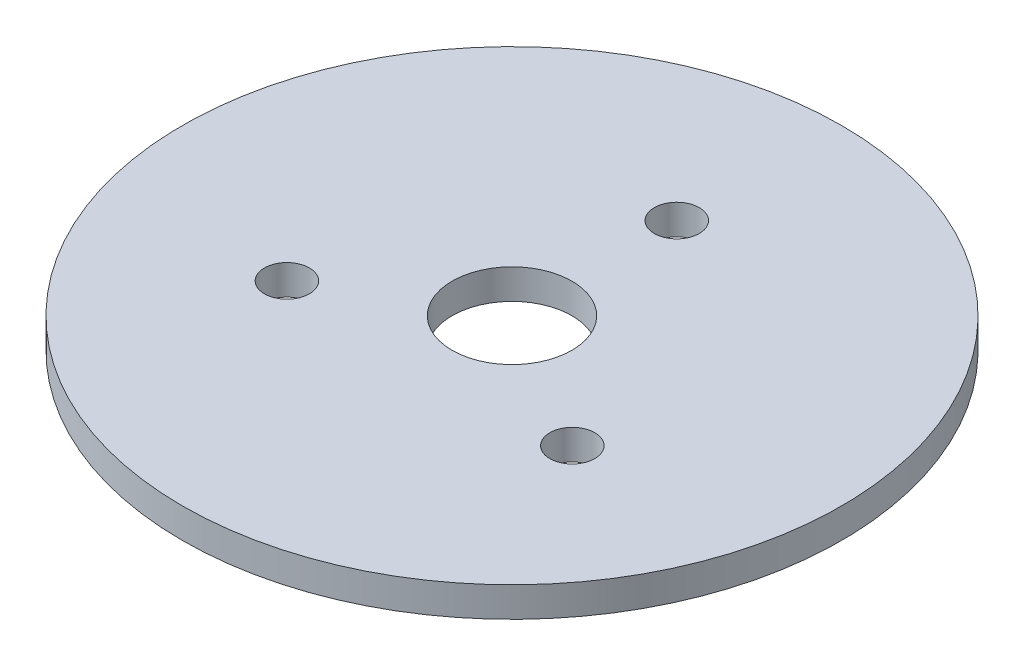
ISO-10303-21;
HEADER;
FILE_DESCRIPTION(('STEP AP214'),'2;1');
FILE_NAME('part.step','',(''),(''),'','','');
FILE_SCHEMA(('AUTOMOTIVE_DESIGN { 1 0 10303 214 1 1 1 1 }'));
ENDSEC;
DATA;
#1=APPLICATION_CONTEXT('core data for automotive mechanical design processes');
#2=APPLICATION_PROTOCOL_DEFINITION('international standard','automotive_design',2000,#1);
#3=PRODUCT_CONTEXT('',#1,'mechanical');
#4=PRODUCT('Part','Part','',(#3));
#5=PRODUCT_RELATED_PRODUCT_CATEGORY('part','',(#4));
#6=PRODUCT_DEFINITION_FORMATION('','',#4);
#7=PRODUCT_DEFINITION_CONTEXT('part definition',#1,'design');
#8=PRODUCT_DEFINITION('design','',#6,#7);
#9=PRODUCT_DEFINITION_SHAPE('','',#8);
#10=(LENGTH_UNIT() NAMED_UNIT(*) SI_UNIT(.MILLI.,.METRE.));
#11=(NAMED_UNIT(*) PLANE_ANGLE_UNIT() SI_UNIT($,.RADIAN.));
#12=(NAMED_UNIT(*) SI_UNIT($,.STERADIAN.) SOLID_ANGLE_UNIT());
#13=UNCERTAINTY_MEASURE_WITH_UNIT(LENGTH_MEASURE(1.E-05),#10,'distance_accuracy_value','');
#14=(GEOMETRIC_REPRESENTATION_CONTEXT(3) GLOBAL_UNCERTAINTY_ASSIGNED_CONTEXT((#13)) GLOBAL_UNIT_ASSIGNED_CONTEXT((#10,
#11,#12)) REPRESENTATION_CONTEXT('',''));
#15=CARTESIAN_POINT('',(0.,0.,0.));
#16=DIRECTION('',(0.,0.,1.));
#17=DIRECTION('',(1.,0.,0.));
#18=AXIS2_PLACEMENT_3D('',#15,#16,#17);
#19=CARTESIAN_POINT('',(0.,2.,0.));
#20=DIRECTION('',(0.,1.,0.));
#21=DIRECTION('',(0.,0.,1.));
#22=AXIS2_PLACEMENT_3D('',#19,#20,#21);
#23=PLANE('',#22);
#24=CARTESIAN_POINT('',(9.52627944162929,2.,5.49999999999973));
#25=DIRECTION('',(0.,1.,0.));
#26=DIRECTION('',(0.,0.,1.));
#27=AXIS2_PLACEMENT_3D('',#24,#25,#26);
#28=CIRCLE('',#27,1.50000000000042);
#29=CARTESIAN_POINT('',(9.52627944162929,2.,7.00000000000015));
#30=VERTEX_POINT('',#29);
#31=EDGE_CURVE('E56',#30,#30,#28,.T.);
#32=ORIENTED_EDGE('',*,*,#31,.F.);
#33=EDGE_LOOP('',(#32));
#34=FACE_BOUND('',#33,.T.);
#35=CARTESIAN_POINT('',(0.,2.,0.));
#36=DIRECTION('',(0.,1.,0.));
#37=DIRECTION('',(0.,0.,1.));
#38=AXIS2_PLACEMENT_3D('',#35,#36,#37);
#39=CIRCLE('',#38,4.);
#40=CARTESIAN_POINT('',(0.,2.,4.));
#41=VERTEX_POINT('',#40);
#42=EDGE_CURVE('E48',#41,#41,#39,.T.);
#43=ORIENTED_EDGE('',*,*,#42,.F.);
#44=EDGE_LOOP('',(#43));
#45=FACE_BOUND('',#44,.T.);
#46=CARTESIAN_POINT('',(0.,2.,0.));
#47=DIRECTION('',(0.,1.,0.));
#48=DIRECTION('',(0.,0.,1.));
#49=AXIS2_PLACEMENT_3D('',#46,#47,#48);
#50=CIRCLE('',#49,22.);
#51=CARTESIAN_POINT('',(0.,2.,22.));
#52=VERTEX_POINT('',#51);
#53=EDGE_CURVE('E10',#52,#52,#50,.T.);
#54=ORIENTED_EDGE('',*,*,#53,.T.);
#55=EDGE_LOOP('',(#54));
#56=FACE_BOUND('',#55,.T.);
#57=CARTESIAN_POINT('',(0.,2.,-11.));
#58=DIRECTION('',(0.,1.,0.));
#59=DIRECTION('',(0.,0.,1.));
#60=AXIS2_PLACEMENT_3D('',#57,#58,#59);
#61=CIRCLE('',#60,1.5);
#62=CARTESIAN_POINT('',(0.,2.,-9.5));
#63=VERTEX_POINT('',#62);
#64=EDGE_CURVE('E52',#63,#63,#61,.T.);
#65=ORIENTED_EDGE('',*,*,#64,.F.);
#66=EDGE_LOOP('',(#65));
#67=FACE_BOUND('',#66,.T.);
#68=CARTESIAN_POINT('',(-9.52627944162836,2.,5.50000000000027));
#69=DIRECTION('',(0.,1.,0.));
#70=DIRECTION('',(0.,0.,1.));
#71=AXIS2_PLACEMENT_3D('',#68,#69,#70);
#72=CIRCLE('',#71,1.50000000000062);
#73=CARTESIAN_POINT('',(-9.52627944162836,2.,7.00000000000088));
#74=VERTEX_POINT('',#73);
#75=EDGE_CURVE('E65',#74,#74,#72,.T.);
#76=ORIENTED_EDGE('',*,*,#75,.F.);
#77=EDGE_LOOP('',(#76));
#78=FACE_BOUND('',#77,.T.);
#79=ADVANCED_FACE('F40',(#34,#45,#56,#67,#78),#23,.T.);
#80=CARTESIAN_POINT('',(0.,0.,0.));
#81=DIRECTION('',(0.,1.,0.));
#82=DIRECTION('',(0.,0.,1.));
#83=AXIS2_PLACEMENT_3D('',#80,#81,#82);
#84=PLANE('',#83);
#85=CARTESIAN_POINT('',(0.,0.,0.));
#86=DIRECTION('',(0.,1.,0.));
#87=DIRECTION('',(0.,0.,1.));
#88=AXIS2_PLACEMENT_3D('',#85,#86,#87);
#89=CIRCLE('',#88,22.);
#90=CARTESIAN_POINT('',(0.,0.,22.));
#91=VERTEX_POINT('',#90);
#92=EDGE_CURVE('E41',#91,#91,#89,.T.);
#93=ORIENTED_EDGE('',*,*,#92,.F.);
#94=EDGE_LOOP('',(#93));
#95=FACE_BOUND('',#94,.T.);
#96=CARTESIAN_POINT('',(0.,0.,0.));
#97=DIRECTION('',(0.,1.,0.));
#98=DIRECTION('',(0.,0.,1.));
#99=AXIS2_PLACEMENT_3D('',#96,#97,#98);
#100=CIRCLE('',#99,4.);
#101=CARTESIAN_POINT('',(0.,0.,4.));
#102=VERTEX_POINT('',#101);
#103=EDGE_CURVE('E49',#102,#102,#100,.T.);
#104=ORIENTED_EDGE('',*,*,#103,.T.);
#105=EDGE_LOOP('',(#104));
#106=FACE_BOUND('',#105,.T.);
#107=CARTESIAN_POINT('',(0.,0.,-11.));
#108=DIRECTION('',(0.,1.,0.));
#109=DIRECTION('',(0.,0.,1.));
#110=AXIS2_PLACEMENT_3D('',#107,#108,#109);
#111=CIRCLE('',#110,1.5);
#112=CARTESIAN_POINT('',(0.,0.,-9.5));
#113=VERTEX_POINT('',#112);
#114=EDGE_CURVE('E57',#113,#113,#111,.T.);
#115=ORIENTED_EDGE('',*,*,#114,.T.);
#116=EDGE_LOOP('',(#115));
#117=FACE_BOUND('',#116,.T.);
#118=CARTESIAN_POINT('',(9.52627944162929,0.,5.49999999999973));
#119=DIRECTION('',(0.,1.,0.));
#120=DIRECTION('',(0.,0.,1.));
#121=AXIS2_PLACEMENT_3D('',#118,#119,#120);
#122=CIRCLE('',#121,1.50000000000042);
#123=CARTESIAN_POINT('',(9.52627944162929,0.,7.00000000000015));
#124=VERTEX_POINT('',#123);
#125=EDGE_CURVE('E62',#124,#124,#122,.T.);
#126=ORIENTED_EDGE('',*,*,#125,.T.);
#127=EDGE_LOOP('',(#126));
#128=FACE_BOUND('',#127,.T.);
#129=CARTESIAN_POINT('',(-9.52627944162836,0.,5.50000000000027));
#130=DIRECTION('',(0.,1.,0.));
#131=DIRECTION('',(0.,0.,1.));
#132=AXIS2_PLACEMENT_3D('',#129,#130,#131);
#133=CIRCLE('',#132,1.50000000000062);
#134=CARTESIAN_POINT('',(-9.52627944162836,0.,7.00000000000088));
#135=VERTEX_POINT('',#134);
#136=EDGE_CURVE('E66',#135,#135,#133,.T.);
#137=ORIENTED_EDGE('',*,*,#136,.T.);
#138=EDGE_LOOP('',(#137));
#139=FACE_BOUND('',#138,.T.);
#140=ADVANCED_FACE('F76',(#95,#106,#117,#128,#139),#84,.F.);
#141=CARTESIAN_POINT('',(0.,2.,0.));
#142=DIRECTION('',(0.,-1.,0.));
#143=DIRECTION('',(0.,0.,-1.));
#144=AXIS2_PLACEMENT_3D('',#141,#142,#143);
#145=CYLINDRICAL_SURFACE('',#144,22.);
#146=ORIENTED_EDGE('',*,*,#53,.F.);
#147=EDGE_LOOP('',(#146));
#148=FACE_BOUND('',#147,.T.);
#149=ORIENTED_EDGE('',*,*,#92,.T.);
#150=EDGE_LOOP('',(#149));
#151=FACE_BOUND('',#150,.T.);
#152=ADVANCED_FACE('F39',(#148,#151),#145,.T.);
#153=CARTESIAN_POINT('',(0.,2.,0.));
#154=DIRECTION('',(0.,-1.,0.));
#155=DIRECTION('',(0.,0.,-1.));
#156=AXIS2_PLACEMENT_3D('',#153,#154,#155);
#157=CYLINDRICAL_SURFACE('',#156,4.);
#158=ORIENTED_EDGE('',*,*,#42,.T.);
#159=EDGE_LOOP('',(#158));
#160=FACE_BOUND('',#159,.T.);
#161=ORIENTED_EDGE('',*,*,#103,.F.);
#162=EDGE_LOOP('',(#161));
#163=FACE_BOUND('',#162,.T.);
#164=ADVANCED_FACE('F88',(#160,#163),#157,.F.);
#165=CARTESIAN_POINT('',(0.,2.,-11.));
#166=DIRECTION('',(0.,-1.,0.));
#167=DIRECTION('',(0.,0.,-1.));
#168=AXIS2_PLACEMENT_3D('',#165,#166,#167);
#169=CYLINDRICAL_SURFACE('',#168,1.5);
#170=ORIENTED_EDGE('',*,*,#64,.T.);
#171=EDGE_LOOP('',(#170));
#172=FACE_BOUND('',#171,.T.);
#173=ORIENTED_EDGE('',*,*,#114,.F.);
#174=EDGE_LOOP('',(#173));
#175=FACE_BOUND('',#174,.T.);
#176=ADVANCED_FACE('F91',(#172,#175),#169,.F.);
#177=CARTESIAN_POINT('',(9.52627944162929,2.,5.49999999999973));
#178=DIRECTION('',(0.,-1.,0.));
#179=DIRECTION('',(0.,0.,-1.));
#180=AXIS2_PLACEMENT_3D('',#177,#178,#179);
#181=CYLINDRICAL_SURFACE('',#180,1.50000000000042);
#182=ORIENTED_EDGE('',*,*,#31,.T.);
#183=EDGE_LOOP('',(#182));
#184=FACE_BOUND('',#183,.T.);
#185=ORIENTED_EDGE('',*,*,#125,.F.);
#186=EDGE_LOOP('',(#185));
#187=FACE_BOUND('',#186,.T.);
#188=ADVANCED_FACE('F94',(#184,#187),#181,.F.);
#189=CARTESIAN_POINT('',(-9.52627944162836,2.,5.50000000000027));
#190=DIRECTION('',(0.,-1.,0.));
#191=DIRECTION('',(0.,0.,-1.));
#192=AXIS2_PLACEMENT_3D('',#189,#190,#191);
#193=CYLINDRICAL_SURFACE('',#192,1.50000000000062);
#194=ORIENTED_EDGE('',*,*,#75,.T.);
#195=EDGE_LOOP('',(#194));
#196=FACE_BOUND('',#195,.T.);
#197=ORIENTED_EDGE('',*,*,#136,.F.);
#198=EDGE_LOOP('',(#197));
#199=FACE_BOUND('',#198,.T.);
#200=ADVANCED_FACE('F73',(#196,#199),#193,.F.);
#201=CLOSED_SHELL('',(#79,#140,#152,#164,#176,#188,#200));
#202=MANIFOLD_SOLID_BREP('B2',#201);
#203=ADVANCED_BREP_SHAPE_REPRESENTATION('',(#18,#202),#14);
#204=SHAPE_DEFINITION_REPRESENTATION(#9,#203);
ENDSEC;
END-ISO-10303-21;
